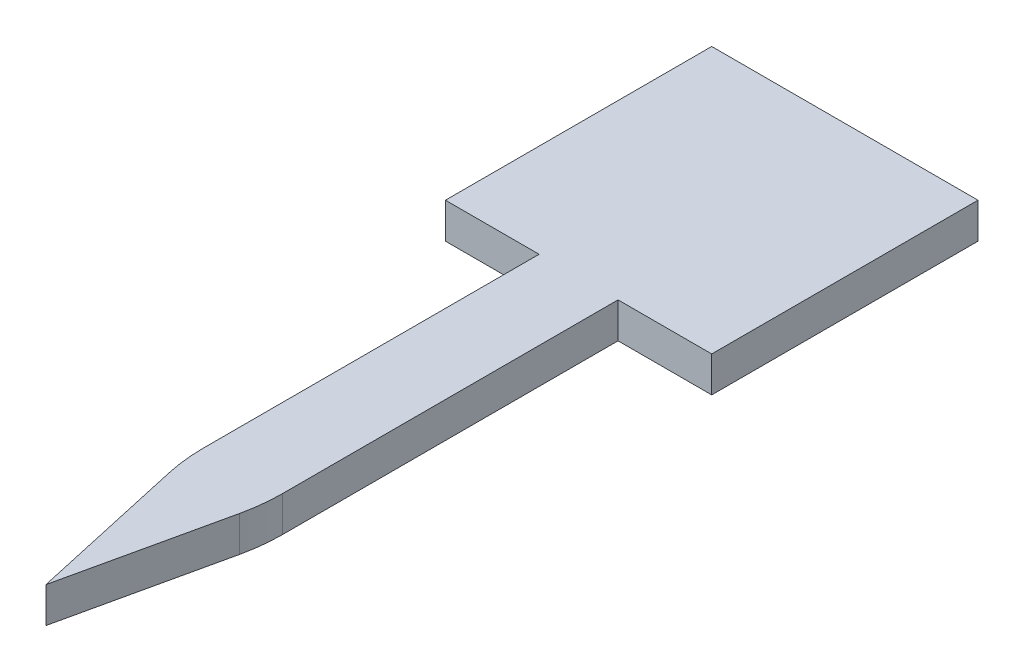
ISO-10303-21;
HEADER;
FILE_DESCRIPTION(('STEP AP214'),'2;1');
FILE_NAME('part.step','',(''),(''),'','','');
FILE_SCHEMA(('AUTOMOTIVE_DESIGN { 1 0 10303 214 1 1 1 1 }'));
ENDSEC;
DATA;
#1=APPLICATION_CONTEXT('core data for automotive mechanical design processes');
#2=APPLICATION_PROTOCOL_DEFINITION('international standard','automotive_design',2000,#1);
#3=PRODUCT_CONTEXT('',#1,'mechanical');
#4=PRODUCT('Part','Part','',(#3));
#5=PRODUCT_RELATED_PRODUCT_CATEGORY('part','',(#4));
#6=PRODUCT_DEFINITION_FORMATION('','',#4);
#7=PRODUCT_DEFINITION_CONTEXT('part definition',#1,'design');
#8=PRODUCT_DEFINITION('design','',#6,#7);
#9=PRODUCT_DEFINITION_SHAPE('','',#8);
#10=(LENGTH_UNIT() NAMED_UNIT(*) SI_UNIT(.MILLI.,.METRE.));
#11=(NAMED_UNIT(*) PLANE_ANGLE_UNIT() SI_UNIT($,.RADIAN.));
#12=(NAMED_UNIT(*) SI_UNIT($,.STERADIAN.) SOLID_ANGLE_UNIT());
#13=UNCERTAINTY_MEASURE_WITH_UNIT(LENGTH_MEASURE(1.E-05),#10,'distance_accuracy_value','');
#14=(GEOMETRIC_REPRESENTATION_CONTEXT(3) GLOBAL_UNCERTAINTY_ASSIGNED_CONTEXT((#13)) GLOBAL_UNIT_ASSIGNED_CONTEXT((#10,
#11,#12)) REPRESENTATION_CONTEXT('',''));
#15=CARTESIAN_POINT('',(0.,0.,0.));
#16=DIRECTION('',(0.,0.,1.));
#17=DIRECTION('',(1.,0.,0.));
#18=AXIS2_PLACEMENT_3D('',#15,#16,#17);
#19=CARTESIAN_POINT('',(-7.5,2.,7.5));
#20=DIRECTION('',(0.,0.,-1.));
#21=DIRECTION('',(-1.,0.,0.));
#22=AXIS2_PLACEMENT_3D('',#19,#20,#21);
#23=PLANE('',#22);
#24=DIRECTION('',(0.,-1.,0.));
#25=VECTOR('',#24,1.);
#26=CARTESIAN_POINT('',(-2.22422547289909,0.,7.5));
#27=LINE('',#26,#25);
#28=CARTESIAN_POINT('',(-2.22422547289909,2.,7.5));
#29=VERTEX_POINT('',#28);
#30=CARTESIAN_POINT('',(-2.22422547289909,0.,7.5));
#31=VERTEX_POINT('',#30);
#32=EDGE_CURVE('E140',#29,#31,#27,.T.);
#33=ORIENTED_EDGE('',*,*,#32,.F.);
#34=DIRECTION('',(1.,0.,0.));
#35=VECTOR('',#34,1.);
#36=CARTESIAN_POINT('',(-7.5,2.,7.5));
#37=LINE('',#36,#35);
#38=CARTESIAN_POINT('',(-7.5,2.,7.5));
#39=VERTEX_POINT('',#38);
#40=EDGE_CURVE('E165',#39,#29,#37,.T.);
#41=ORIENTED_EDGE('',*,*,#40,.F.);
#42=DIRECTION('',(0.,-1.,0.));
#43=VECTOR('',#42,1.);
#44=CARTESIAN_POINT('',(-7.5,2.,7.5));
#45=LINE('',#44,#43);
#46=CARTESIAN_POINT('',(-7.5,0.,7.5));
#47=VERTEX_POINT('',#46);
#48=EDGE_CURVE('E180',#39,#47,#45,.T.);
#49=ORIENTED_EDGE('',*,*,#48,.T.);
#50=DIRECTION('',(1.,0.,0.));
#51=VECTOR('',#50,1.);
#52=CARTESIAN_POINT('',(-7.5,0.,7.5));
#53=LINE('',#52,#51);
#54=EDGE_CURVE('E160',#47,#31,#53,.T.);
#55=ORIENTED_EDGE('',*,*,#54,.T.);
#56=EDGE_LOOP('',(#33,#41,#49,#55));
#57=FACE_BOUND('',#56,.T.);
#58=ADVANCED_FACE('F35',(#57),#23,.F.);
#59=CARTESIAN_POINT('',(7.5,2.,7.5));
#60=DIRECTION('',(-1.,0.,0.));
#61=DIRECTION('',(0.,0.,1.));
#62=AXIS2_PLACEMENT_3D('',#59,#60,#61);
#63=PLANE('',#62);
#64=DIRECTION('',(0.,0.,-1.));
#65=VECTOR('',#64,1.);
#66=CARTESIAN_POINT('',(7.5,0.,7.5));
#67=LINE('',#66,#65);
#68=CARTESIAN_POINT('',(7.5,0.,7.5));
#69=VERTEX_POINT('',#68);
#70=CARTESIAN_POINT('',(7.5,0.,-7.5));
#71=VERTEX_POINT('',#70);
#72=EDGE_CURVE('E155',#69,#71,#67,.T.);
#73=ORIENTED_EDGE('',*,*,#72,.T.);
#74=DIRECTION('',(0.,-1.,0.));
#75=VECTOR('',#74,1.);
#76=CARTESIAN_POINT('',(7.5,2.,-7.5));
#77=LINE('',#76,#75);
#78=CARTESIAN_POINT('',(7.5,2.,-7.5));
#79=VERTEX_POINT('',#78);
#80=EDGE_CURVE('E186',#79,#71,#77,.T.);
#81=ORIENTED_EDGE('',*,*,#80,.F.);
#82=DIRECTION('',(0.,0.,-1.));
#83=VECTOR('',#82,1.);
#84=CARTESIAN_POINT('',(7.5,2.,7.5));
#85=LINE('',#84,#83);
#86=CARTESIAN_POINT('',(7.5,2.,7.5));
#87=VERTEX_POINT('',#86);
#88=EDGE_CURVE('E156',#87,#79,#85,.T.);
#89=ORIENTED_EDGE('',*,*,#88,.F.);
#90=DIRECTION('',(0.,-1.,0.));
#91=VECTOR('',#90,1.);
#92=CARTESIAN_POINT('',(7.5,2.,7.5));
#93=LINE('',#92,#91);
#94=EDGE_CURVE('E168',#87,#69,#93,.T.);
#95=ORIENTED_EDGE('',*,*,#94,.T.);
#96=EDGE_LOOP('',(#73,#81,#89,#95));
#97=FACE_BOUND('',#96,.T.);
#98=ADVANCED_FACE('F214',(#97),#63,.F.);
#99=CARTESIAN_POINT('',(-7.5,2.,-7.5));
#100=DIRECTION('',(0.,0.,1.));
#101=DIRECTION('',(1.,0.,0.));
#102=AXIS2_PLACEMENT_3D('',#99,#100,#101);
#103=PLANE('',#102);
#104=DIRECTION('',(-1.,0.,0.));
#105=VECTOR('',#104,1.);
#106=CARTESIAN_POINT('',(-7.5,0.,-7.5));
#107=LINE('',#106,#105);
#108=CARTESIAN_POINT('',(-7.5,0.,-7.5));
#109=VERTEX_POINT('',#108);
#110=EDGE_CURVE('E171',#71,#109,#107,.T.);
#111=ORIENTED_EDGE('',*,*,#110,.T.);
#112=DIRECTION('',(0.,-1.,0.));
#113=VECTOR('',#112,1.);
#114=CARTESIAN_POINT('',(-7.5,2.,-7.5));
#115=LINE('',#114,#113);
#116=CARTESIAN_POINT('',(-7.5,2.,-7.5));
#117=VERTEX_POINT('',#116);
#118=EDGE_CURVE('E183',#117,#109,#115,.T.);
#119=ORIENTED_EDGE('',*,*,#118,.F.);
#120=DIRECTION('',(-1.,0.,0.));
#121=VECTOR('',#120,1.);
#122=CARTESIAN_POINT('',(-7.5,2.,-7.5));
#123=LINE('',#122,#121);
#124=EDGE_CURVE('E159',#79,#117,#123,.T.);
#125=ORIENTED_EDGE('',*,*,#124,.F.);
#126=ORIENTED_EDGE('',*,*,#80,.T.);
#127=EDGE_LOOP('',(#111,#119,#125,#126));
#128=FACE_BOUND('',#127,.T.);
#129=ADVANCED_FACE('F229',(#128),#103,.F.);
#130=CARTESIAN_POINT('',(-7.5,2.,7.5));
#131=DIRECTION('',(1.,0.,0.));
#132=DIRECTION('',(0.,0.,-1.));
#133=AXIS2_PLACEMENT_3D('',#130,#131,#132);
#134=PLANE('',#133);
#135=DIRECTION('',(0.,0.,1.));
#136=VECTOR('',#135,1.);
#137=CARTESIAN_POINT('',(-7.5,0.,7.5));
#138=LINE('',#137,#136);
#139=EDGE_CURVE('E173',#109,#47,#138,.T.);
#140=ORIENTED_EDGE('',*,*,#139,.T.);
#141=ORIENTED_EDGE('',*,*,#48,.F.);
#142=DIRECTION('',(0.,0.,1.));
#143=VECTOR('',#142,1.);
#144=CARTESIAN_POINT('',(-7.5,2.,7.5));
#145=LINE('',#144,#143);
#146=EDGE_CURVE('E162',#117,#39,#145,.T.);
#147=ORIENTED_EDGE('',*,*,#146,.F.);
#148=ORIENTED_EDGE('',*,*,#118,.T.);
#149=EDGE_LOOP('',(#140,#141,#147,#148));
#150=FACE_BOUND('',#149,.T.);
#151=ADVANCED_FACE('F235',(#150),#134,.F.);
#152=CARTESIAN_POINT('',(2.22422547289909,2.,7.5));
#153=VERTEX_POINT('',#152);
#154=EDGE_CURVE('E164',#153,#87,#37,.T.);
#155=ORIENTED_EDGE('',*,*,#154,.F.);
#156=DIRECTION('',(0.,-1.,0.));
#157=VECTOR('',#156,1.);
#158=CARTESIAN_POINT('',(2.22422547289909,0.,7.5));
#159=LINE('',#158,#157);
#160=CARTESIAN_POINT('',(2.22422547289909,0.,7.5));
#161=VERTEX_POINT('',#160);
#162=EDGE_CURVE('E137',#153,#161,#159,.T.);
#163=ORIENTED_EDGE('',*,*,#162,.T.);
#164=EDGE_CURVE('E175',#161,#69,#53,.T.);
#165=ORIENTED_EDGE('',*,*,#164,.T.);
#166=ORIENTED_EDGE('',*,*,#94,.F.);
#167=EDGE_LOOP('',(#155,#163,#165,#166));
#168=FACE_BOUND('',#167,.T.);
#169=ADVANCED_FACE('F211',(#168),#23,.F.);
#170=CARTESIAN_POINT('',(0.,2.,0.));
#171=DIRECTION('',(0.,-1.,0.));
#172=DIRECTION('',(0.,0.,-1.));
#173=AXIS2_PLACEMENT_3D('',#170,#171,#172);
#174=PLANE('',#173);
#175=DIRECTION('',(0.217116798120804,0.,-0.976145632563999));
#176=VECTOR('',#175,1.);
#177=CARTESIAN_POINT('',(0.,2.,37.5));
#178=LINE('',#177,#176);
#179=CARTESIAN_POINT('',(0.,2.,37.5));
#180=VERTEX_POINT('',#179);
#181=CARTESIAN_POINT('',(1.98568179853908,2.,28.5724797340311));
#182=VERTEX_POINT('',#181);
#183=EDGE_CURVE('E119',#180,#182,#178,.T.);
#184=ORIENTED_EDGE('',*,*,#183,.T.);
#185=CARTESIAN_POINT('',(-7.77577452710091,2.,26.4013117528231));
#186=DIRECTION('',(0.,-1.,0.));
#187=DIRECTION('',(0.,0.,-1.));
#188=AXIS2_PLACEMENT_3D('',#185,#186,#187);
#189=CIRCLE('',#188,10.);
#190=CARTESIAN_POINT('',(2.22422547289909,2.,26.4013117528231));
#191=VERTEX_POINT('',#190);
#192=EDGE_CURVE('E11',#182,#191,#189,.F.);
#193=ORIENTED_EDGE('',*,*,#192,.T.);
#194=DIRECTION('',(0.,0.,-1.));
#195=VECTOR('',#194,1.);
#196=CARTESIAN_POINT('',(2.22422547289909,2.,27.5));
#197=LINE('',#196,#195);
#198=EDGE_CURVE('E153',#191,#153,#197,.T.);
#199=ORIENTED_EDGE('',*,*,#198,.T.);
#200=ORIENTED_EDGE('',*,*,#154,.T.);
#201=ORIENTED_EDGE('',*,*,#88,.T.);
#202=ORIENTED_EDGE('',*,*,#124,.T.);
#203=ORIENTED_EDGE('',*,*,#146,.T.);
#204=ORIENTED_EDGE('',*,*,#40,.T.);
#205=DIRECTION('',(0.,0.,-1.));
#206=VECTOR('',#205,1.);
#207=CARTESIAN_POINT('',(-2.22422547289909,2.,27.5));
#208=LINE('',#207,#206);
#209=CARTESIAN_POINT('',(-2.22422547289909,2.,26.4013117528231));
#210=VERTEX_POINT('',#209);
#211=EDGE_CURVE('E151',#210,#29,#208,.T.);
#212=ORIENTED_EDGE('',*,*,#211,.F.);
#213=CARTESIAN_POINT('',(7.77577452710091,2.,26.4013117528231));
#214=DIRECTION('',(0.,-1.,0.));
#215=DIRECTION('',(0.,0.,-1.));
#216=AXIS2_PLACEMENT_3D('',#213,#214,#215);
#217=CIRCLE('',#216,10.);
#218=CARTESIAN_POINT('',(-1.98568179853908,2.,28.5724797340311));
#219=VERTEX_POINT('',#218);
#220=EDGE_CURVE('E123',#210,#219,#217,.F.);
#221=ORIENTED_EDGE('',*,*,#220,.T.);
#222=DIRECTION('',(0.217116798120804,0.,0.976145632563999));
#223=VECTOR('',#222,1.);
#224=CARTESIAN_POINT('',(0.,2.,37.5));
#225=LINE('',#224,#223);
#226=EDGE_CURVE('E117',#219,#180,#225,.T.);
#227=ORIENTED_EDGE('',*,*,#226,.T.);
#228=EDGE_LOOP('',(#184,#193,#199,#200,#201,#202,#203,#204,#212,#221,#227));
#229=FACE_BOUND('',#228,.T.);
#230=ADVANCED_FACE('F118',(#229),#174,.F.);
#231=CARTESIAN_POINT('',(0.,0.,0.));
#232=DIRECTION('',(0.,-1.,0.));
#233=DIRECTION('',(0.,0.,-1.));
#234=AXIS2_PLACEMENT_3D('',#231,#232,#233);
#235=PLANE('',#234);
#236=DIRECTION('',(0.,0.,-1.));
#237=VECTOR('',#236,1.);
#238=CARTESIAN_POINT('',(2.22422547289909,0.,27.5));
#239=LINE('',#238,#237);
#240=CARTESIAN_POINT('',(2.22422547289909,0.,26.4013117528231));
#241=VERTEX_POINT('',#240);
#242=EDGE_CURVE('E147',#241,#161,#239,.T.);
#243=ORIENTED_EDGE('',*,*,#242,.F.);
#244=CARTESIAN_POINT('',(-7.77577452710091,0.,26.4013117528231));
#245=DIRECTION('',(0.,-1.,0.));
#246=DIRECTION('',(0.,0.,-1.));
#247=AXIS2_PLACEMENT_3D('',#244,#245,#246);
#248=CIRCLE('',#247,10.);
#249=CARTESIAN_POINT('',(1.98568179853908,0.,28.5724797340311));
#250=VERTEX_POINT('',#249);
#251=EDGE_CURVE('E57',#241,#250,#248,.T.);
#252=ORIENTED_EDGE('',*,*,#251,.T.);
#253=DIRECTION('',(0.217116798120804,0.,-0.976145632563999));
#254=VECTOR('',#253,1.);
#255=CARTESIAN_POINT('',(0.,0.,37.5));
#256=LINE('',#255,#254);
#257=CARTESIAN_POINT('',(0.,0.,37.5));
#258=VERTEX_POINT('',#257);
#259=EDGE_CURVE('E128',#258,#250,#256,.T.);
#260=ORIENTED_EDGE('',*,*,#259,.F.);
#261=DIRECTION('',(0.217116798120804,0.,0.976145632563999));
#262=VECTOR('',#261,1.);
#263=CARTESIAN_POINT('',(0.,0.,37.5));
#264=LINE('',#263,#262);
#265=CARTESIAN_POINT('',(-1.98568179853908,0.,28.5724797340311));
#266=VERTEX_POINT('',#265);
#267=EDGE_CURVE('E136',#266,#258,#264,.T.);
#268=ORIENTED_EDGE('',*,*,#267,.F.);
#269=CARTESIAN_POINT('',(7.77577452710091,0.,26.4013117528231));
#270=DIRECTION('',(0.,-1.,0.));
#271=DIRECTION('',(0.,0.,-1.));
#272=AXIS2_PLACEMENT_3D('',#269,#270,#271);
#273=CIRCLE('',#272,10.);
#274=CARTESIAN_POINT('',(-2.22422547289909,0.,26.4013117528231));
#275=VERTEX_POINT('',#274);
#276=EDGE_CURVE('E191',#266,#275,#273,.T.);
#277=ORIENTED_EDGE('',*,*,#276,.T.);
#278=DIRECTION('',(0.,0.,-1.));
#279=VECTOR('',#278,1.);
#280=CARTESIAN_POINT('',(-2.22422547289909,0.,27.5));
#281=LINE('',#280,#279);
#282=EDGE_CURVE('E149',#275,#31,#281,.T.);
#283=ORIENTED_EDGE('',*,*,#282,.T.);
#284=ORIENTED_EDGE('',*,*,#54,.F.);
#285=ORIENTED_EDGE('',*,*,#139,.F.);
#286=ORIENTED_EDGE('',*,*,#110,.F.);
#287=ORIENTED_EDGE('',*,*,#72,.F.);
#288=ORIENTED_EDGE('',*,*,#164,.F.);
#289=EDGE_LOOP('',(#243,#252,#260,#268,#277,#283,#284,#285,#286,#287,#288));
#290=FACE_BOUND('',#289,.T.);
#291=ADVANCED_FACE('F206',(#290),#235,.T.);
#292=CARTESIAN_POINT('',(2.22422547289909,0.,27.5));
#293=DIRECTION('',(1.,0.,0.));
#294=DIRECTION('',(0.,0.,-1.));
#295=AXIS2_PLACEMENT_3D('',#292,#293,#294);
#296=PLANE('',#295);
#297=ORIENTED_EDGE('',*,*,#198,.F.);
#298=DIRECTION('',(0.,-1.,0.));
#299=VECTOR('',#298,1.);
#300=CARTESIAN_POINT('',(2.22422547289909,0.,26.4013117528231));
#301=LINE('',#300,#299);
#302=EDGE_CURVE('E196',#191,#241,#301,.T.);
#303=ORIENTED_EDGE('',*,*,#302,.T.);
#304=ORIENTED_EDGE('',*,*,#242,.T.);
#305=ORIENTED_EDGE('',*,*,#162,.F.);
#306=EDGE_LOOP('',(#297,#303,#304,#305));
#307=FACE_BOUND('',#306,.T.);
#308=ADVANCED_FACE('F202',(#307),#296,.T.);
#309=CARTESIAN_POINT('',(-2.22422547289909,0.,27.5));
#310=DIRECTION('',(1.,0.,0.));
#311=DIRECTION('',(0.,0.,-1.));
#312=AXIS2_PLACEMENT_3D('',#309,#310,#311);
#313=PLANE('',#312);
#314=ORIENTED_EDGE('',*,*,#282,.F.);
#315=DIRECTION('',(0.,-1.,0.));
#316=VECTOR('',#315,1.);
#317=CARTESIAN_POINT('',(-2.22422547289909,0.,26.4013117528231));
#318=LINE('',#317,#316);
#319=EDGE_CURVE('E193',#275,#210,#318,.F.);
#320=ORIENTED_EDGE('',*,*,#319,.T.);
#321=ORIENTED_EDGE('',*,*,#211,.T.);
#322=ORIENTED_EDGE('',*,*,#32,.T.);
#323=EDGE_LOOP('',(#314,#320,#321,#322));
#324=FACE_BOUND('',#323,.T.);
#325=ADVANCED_FACE('F255',(#324),#313,.F.);
#326=CARTESIAN_POINT('',(0.,2.,37.5));
#327=DIRECTION('',(0.976145632563999,0.,-0.217116798120804));
#328=DIRECTION('',(-0.217116798120804,0.,-0.976145632563999));
#329=AXIS2_PLACEMENT_3D('',#326,#327,#328);
#330=PLANE('',#329);
#331=ORIENTED_EDGE('',*,*,#226,.F.);
#332=DIRECTION('',(0.,-1.,0.));
#333=VECTOR('',#332,1.);
#334=CARTESIAN_POINT('',(-1.98568179853908,2.,28.5724797340311));
#335=LINE('',#334,#333);
#336=EDGE_CURVE('E189',#219,#266,#335,.T.);
#337=ORIENTED_EDGE('',*,*,#336,.T.);
#338=ORIENTED_EDGE('',*,*,#267,.T.);
#339=DIRECTION('',(0.,-1.,0.));
#340=VECTOR('',#339,1.);
#341=CARTESIAN_POINT('',(0.,2.,37.5));
#342=LINE('',#341,#340);
#343=EDGE_CURVE('E132',#180,#258,#342,.T.);
#344=ORIENTED_EDGE('',*,*,#343,.F.);
#345=EDGE_LOOP('',(#331,#337,#338,#344));
#346=FACE_BOUND('',#345,.T.);
#347=ADVANCED_FACE('F134',(#346),#330,.F.);
#348=CARTESIAN_POINT('',(0.,2.,37.5));
#349=DIRECTION('',(-0.976145632563999,0.,-0.217116798120804));
#350=DIRECTION('',(-0.217116798120804,0.,0.976145632563999));
#351=AXIS2_PLACEMENT_3D('',#348,#349,#350);
#352=PLANE('',#351);
#353=ORIENTED_EDGE('',*,*,#259,.T.);
#354=DIRECTION('',(0.,-1.,0.));
#355=VECTOR('',#354,1.);
#356=CARTESIAN_POINT('',(1.98568179853908,2.,28.5724797340311));
#357=LINE('',#356,#355);
#358=EDGE_CURVE('E43',#250,#182,#357,.F.);
#359=ORIENTED_EDGE('',*,*,#358,.T.);
#360=ORIENTED_EDGE('',*,*,#183,.F.);
#361=ORIENTED_EDGE('',*,*,#343,.T.);
#362=EDGE_LOOP('',(#353,#359,#360,#361));
#363=FACE_BOUND('',#362,.T.);
#364=ADVANCED_FACE('F131',(#363),#352,.F.);
#365=CARTESIAN_POINT('',(7.77577452710091,2.,26.4013117528231));
#366=DIRECTION('',(0.,-1.,0.));
#367=DIRECTION('',(0.,0.,-1.));
#368=AXIS2_PLACEMENT_3D('',#365,#366,#367);
#369=CYLINDRICAL_SURFACE('',#368,10.);
#370=ORIENTED_EDGE('',*,*,#220,.F.);
#371=ORIENTED_EDGE('',*,*,#319,.F.);
#372=ORIENTED_EDGE('',*,*,#276,.F.);
#373=ORIENTED_EDGE('',*,*,#336,.F.);
#374=EDGE_LOOP('',(#370,#371,#372,#373));
#375=FACE_BOUND('',#374,.T.);
#376=ADVANCED_FACE('F218',(#375),#369,.T.);
#377=CARTESIAN_POINT('',(-7.77577452710091,0.,26.4013117528231));
#378=DIRECTION('',(0.,1.,0.));
#379=DIRECTION('',(0.,0.,1.));
#380=AXIS2_PLACEMENT_3D('',#377,#378,#379);
#381=CYLINDRICAL_SURFACE('',#380,10.);
#382=ORIENTED_EDGE('',*,*,#192,.F.);
#383=ORIENTED_EDGE('',*,*,#358,.F.);
#384=ORIENTED_EDGE('',*,*,#251,.F.);
#385=ORIENTED_EDGE('',*,*,#302,.F.);
#386=EDGE_LOOP('',(#382,#383,#384,#385));
#387=FACE_BOUND('',#386,.T.);
#388=ADVANCED_FACE('F37',(#387),#381,.T.);
#389=CLOSED_SHELL('',(#58,#98,#129,#151,#169,#230,#291,#308,#325,#347,#364,#376,#388));
#390=MANIFOLD_SOLID_BREP('B2',#389);
#391=ADVANCED_BREP_SHAPE_REPRESENTATION('',(#18,#390),#14);
#392=SHAPE_DEFINITION_REPRESENTATION(#9,#391);
ENDSEC;
END-ISO-10303-21;
